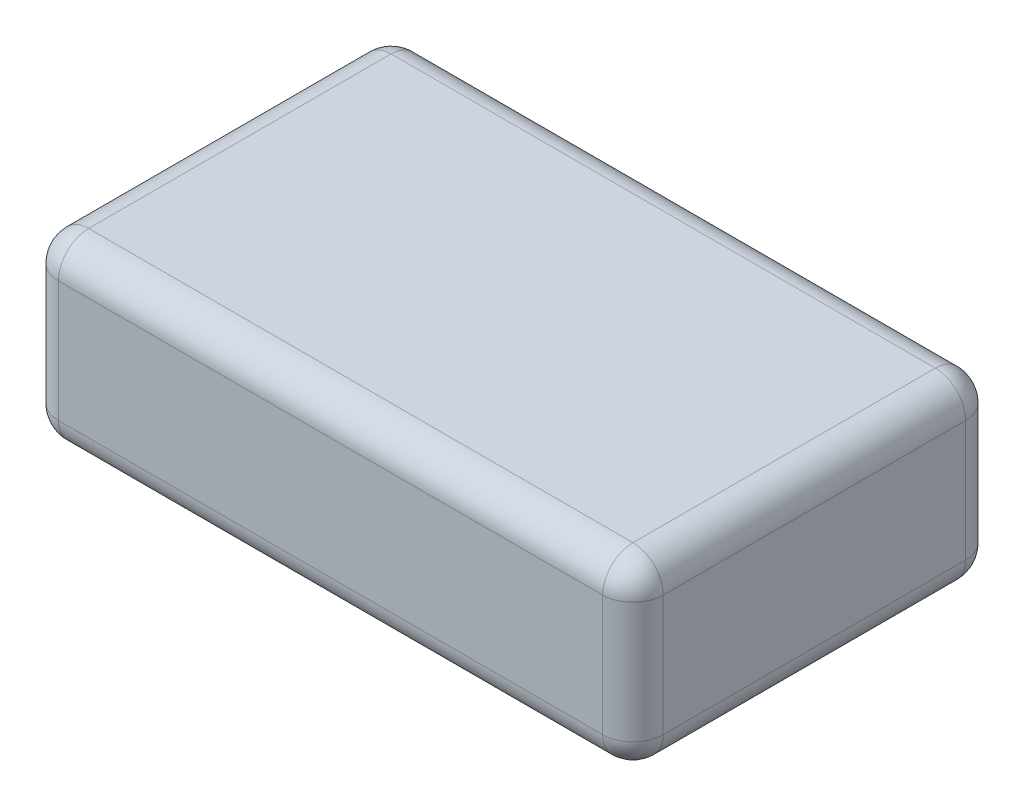
ISO-10303-21;
HEADER;
FILE_DESCRIPTION(('STEP AP214'),'2;1');
FILE_NAME('part.step','',(''),(''),'','','');
FILE_SCHEMA(('AUTOMOTIVE_DESIGN { 1 0 10303 214 1 1 1 1 }'));
ENDSEC;
DATA;
#1=APPLICATION_CONTEXT('core data for automotive mechanical design processes');
#2=APPLICATION_PROTOCOL_DEFINITION('international standard','automotive_design',2000,#1);
#3=PRODUCT_CONTEXT('',#1,'mechanical');
#4=PRODUCT('Part','Part','',(#3));
#5=PRODUCT_RELATED_PRODUCT_CATEGORY('part','',(#4));
#6=PRODUCT_DEFINITION_FORMATION('','',#4);
#7=PRODUCT_DEFINITION_CONTEXT('part definition',#1,'design');
#8=PRODUCT_DEFINITION('design','',#6,#7);
#9=PRODUCT_DEFINITION_SHAPE('','',#8);
#10=(LENGTH_UNIT() NAMED_UNIT(*) SI_UNIT(.MILLI.,.METRE.));
#11=(NAMED_UNIT(*) PLANE_ANGLE_UNIT() SI_UNIT($,.RADIAN.));
#12=(NAMED_UNIT(*) SI_UNIT($,.STERADIAN.) SOLID_ANGLE_UNIT());
#13=UNCERTAINTY_MEASURE_WITH_UNIT(LENGTH_MEASURE(1.E-05),#10,'distance_accuracy_value','');
#14=(GEOMETRIC_REPRESENTATION_CONTEXT(3) GLOBAL_UNCERTAINTY_ASSIGNED_CONTEXT((#13)) GLOBAL_UNIT_ASSIGNED_CONTEXT((#10,
#11,#12)) REPRESENTATION_CONTEXT('',''));
#15=CARTESIAN_POINT('',(0.,0.,0.));
#16=DIRECTION('',(0.,0.,1.));
#17=DIRECTION('',(1.,0.,0.));
#18=AXIS2_PLACEMENT_3D('',#15,#16,#17);
#19=CARTESIAN_POINT('',(100.,60.,60.));
#20=DIRECTION('',(-1.,0.,0.));
#21=DIRECTION('',(0.,0.,1.));
#22=AXIS2_PLACEMENT_3D('',#19,#20,#21);
#23=PLANE('',#22);
#24=DIRECTION('',(0.,0.,-1.));
#25=VECTOR('',#24,1.);
#26=CARTESIAN_POINT('',(100.,50.,60.));
#27=LINE('',#26,#25);
#28=CARTESIAN_POINT('',(100.,50.,-50.));
#29=VERTEX_POINT('',#28);
#30=CARTESIAN_POINT('',(100.,50.,50.));
#31=VERTEX_POINT('',#30);
#32=EDGE_CURVE('E49',#29,#31,#27,.F.);
#33=ORIENTED_EDGE('',*,*,#32,.T.);
#34=DIRECTION('',(0.,-1.,0.));
#35=VECTOR('',#34,1.);
#36=CARTESIAN_POINT('',(100.,60.,50.));
#37=LINE('',#36,#35);
#38=CARTESIAN_POINT('',(100.,10.,50.));
#39=VERTEX_POINT('',#38);
#40=EDGE_CURVE('E11',#31,#39,#37,.T.);
#41=ORIENTED_EDGE('',*,*,#40,.T.);
#42=DIRECTION('',(0.,0.,-1.));
#43=VECTOR('',#42,1.);
#44=CARTESIAN_POINT('',(100.,10.,-60.));
#45=LINE('',#44,#43);
#46=CARTESIAN_POINT('',(100.,10.,-50.));
#47=VERTEX_POINT('',#46);
#48=EDGE_CURVE('E249',#39,#47,#45,.T.);
#49=ORIENTED_EDGE('',*,*,#48,.T.);
#50=DIRECTION('',(0.,-1.,0.));
#51=VECTOR('',#50,1.);
#52=CARTESIAN_POINT('',(100.,60.,-50.));
#53=LINE('',#52,#51);
#54=EDGE_CURVE('E60',#47,#29,#53,.F.);
#55=ORIENTED_EDGE('',*,*,#54,.T.);
#56=EDGE_LOOP('',(#33,#41,#49,#55));
#57=FACE_BOUND('',#56,.T.);
#58=ADVANCED_FACE('F39',(#57),#23,.F.);
#59=CARTESIAN_POINT('',(-100.,60.,-60.));
#60=DIRECTION('',(0.,0.,1.));
#61=DIRECTION('',(1.,0.,0.));
#62=AXIS2_PLACEMENT_3D('',#59,#60,#61);
#63=PLANE('',#62);
#64=DIRECTION('',(0.,-1.,0.));
#65=VECTOR('',#64,1.);
#66=CARTESIAN_POINT('',(-90.,60.,-60.));
#67=LINE('',#66,#65);
#68=CARTESIAN_POINT('',(-90.,10.,-60.));
#69=VERTEX_POINT('',#68);
#70=CARTESIAN_POINT('',(-90.,50.,-60.));
#71=VERTEX_POINT('',#70);
#72=EDGE_CURVE('E244',#69,#71,#67,.F.);
#73=ORIENTED_EDGE('',*,*,#72,.T.);
#74=DIRECTION('',(-1.,0.,0.));
#75=VECTOR('',#74,1.);
#76=CARTESIAN_POINT('',(-100.,50.,-60.));
#77=LINE('',#76,#75);
#78=CARTESIAN_POINT('',(90.,50.,-60.));
#79=VERTEX_POINT('',#78);
#80=EDGE_CURVE('E241',#71,#79,#77,.F.);
#81=ORIENTED_EDGE('',*,*,#80,.T.);
#82=DIRECTION('',(0.,-1.,0.));
#83=VECTOR('',#82,1.);
#84=CARTESIAN_POINT('',(90.,60.,-60.));
#85=LINE('',#84,#83);
#86=CARTESIAN_POINT('',(90.,10.,-60.));
#87=VERTEX_POINT('',#86);
#88=EDGE_CURVE('E233',#79,#87,#85,.T.);
#89=ORIENTED_EDGE('',*,*,#88,.T.);
#90=DIRECTION('',(-1.,0.,0.));
#91=VECTOR('',#90,1.);
#92=CARTESIAN_POINT('',(-100.,10.,-60.));
#93=LINE('',#92,#91);
#94=EDGE_CURVE('E237',#87,#69,#93,.T.);
#95=ORIENTED_EDGE('',*,*,#94,.T.);
#96=EDGE_LOOP('',(#73,#81,#89,#95));
#97=FACE_BOUND('',#96,.T.);
#98=ADVANCED_FACE('F242',(#97),#63,.F.);
#99=CARTESIAN_POINT('',(-100.,60.,60.));
#100=DIRECTION('',(1.,0.,0.));
#101=DIRECTION('',(0.,0.,-1.));
#102=AXIS2_PLACEMENT_3D('',#99,#100,#101);
#103=PLANE('',#102);
#104=DIRECTION('',(0.,0.,1.));
#105=VECTOR('',#104,1.);
#106=CARTESIAN_POINT('',(-100.,10.,60.));
#107=LINE('',#106,#105);
#108=CARTESIAN_POINT('',(-100.,10.,-50.));
#109=VERTEX_POINT('',#108);
#110=CARTESIAN_POINT('',(-100.,10.,50.));
#111=VERTEX_POINT('',#110);
#112=EDGE_CURVE('E296',#109,#111,#107,.T.);
#113=ORIENTED_EDGE('',*,*,#112,.T.);
#114=DIRECTION('',(0.,-1.,0.));
#115=VECTOR('',#114,1.);
#116=CARTESIAN_POINT('',(-100.,60.,50.));
#117=LINE('',#116,#115);
#118=CARTESIAN_POINT('',(-100.,50.,50.));
#119=VERTEX_POINT('',#118);
#120=EDGE_CURVE('E295',#111,#119,#117,.F.);
#121=ORIENTED_EDGE('',*,*,#120,.T.);
#122=DIRECTION('',(0.,0.,1.));
#123=VECTOR('',#122,1.);
#124=CARTESIAN_POINT('',(-100.,50.,60.));
#125=LINE('',#124,#123);
#126=CARTESIAN_POINT('',(-100.,50.,-50.));
#127=VERTEX_POINT('',#126);
#128=EDGE_CURVE('E288',#119,#127,#125,.F.);
#129=ORIENTED_EDGE('',*,*,#128,.T.);
#130=DIRECTION('',(0.,-1.,0.));
#131=VECTOR('',#130,1.);
#132=CARTESIAN_POINT('',(-100.,60.,-50.));
#133=LINE('',#132,#131);
#134=EDGE_CURVE('E347',#127,#109,#133,.T.);
#135=ORIENTED_EDGE('',*,*,#134,.T.);
#136=EDGE_LOOP('',(#113,#121,#129,#135));
#137=FACE_BOUND('',#136,.T.);
#138=ADVANCED_FACE('F299',(#137),#103,.F.);
#139=CARTESIAN_POINT('',(-100.,60.,60.));
#140=DIRECTION('',(0.,0.,-1.));
#141=DIRECTION('',(-1.,0.,0.));
#142=AXIS2_PLACEMENT_3D('',#139,#140,#141);
#143=PLANE('',#142);
#144=DIRECTION('',(1.,0.,0.));
#145=VECTOR('',#144,1.);
#146=CARTESIAN_POINT('',(-100.,50.,60.));
#147=LINE('',#146,#145);
#148=CARTESIAN_POINT('',(90.,50.,60.));
#149=VERTEX_POINT('',#148);
#150=CARTESIAN_POINT('',(-90.,50.,60.));
#151=VERTEX_POINT('',#150);
#152=EDGE_CURVE('E140',#149,#151,#147,.F.);
#153=ORIENTED_EDGE('',*,*,#152,.T.);
#154=DIRECTION('',(0.,-1.,0.));
#155=VECTOR('',#154,1.);
#156=CARTESIAN_POINT('',(-90.,60.,60.));
#157=LINE('',#156,#155);
#158=CARTESIAN_POINT('',(-90.,10.,60.));
#159=VERTEX_POINT('',#158);
#160=EDGE_CURVE('E135',#151,#159,#157,.T.);
#161=ORIENTED_EDGE('',*,*,#160,.T.);
#162=DIRECTION('',(1.,0.,0.));
#163=VECTOR('',#162,1.);
#164=CARTESIAN_POINT('',(100.,10.,60.));
#165=LINE('',#164,#163);
#166=CARTESIAN_POINT('',(90.,10.,60.));
#167=VERTEX_POINT('',#166);
#168=EDGE_CURVE('E129',#159,#167,#165,.T.);
#169=ORIENTED_EDGE('',*,*,#168,.T.);
#170=DIRECTION('',(0.,-1.,0.));
#171=VECTOR('',#170,1.);
#172=CARTESIAN_POINT('',(90.,60.,60.));
#173=LINE('',#172,#171);
#174=EDGE_CURVE('E132',#167,#149,#173,.F.);
#175=ORIENTED_EDGE('',*,*,#174,.T.);
#176=EDGE_LOOP('',(#153,#161,#169,#175));
#177=FACE_BOUND('',#176,.T.);
#178=ADVANCED_FACE('F131',(#177),#143,.F.);
#179=CARTESIAN_POINT('',(0.,60.,0.));
#180=DIRECTION('',(0.,-1.,0.));
#181=DIRECTION('',(0.,0.,-1.));
#182=AXIS2_PLACEMENT_3D('',#179,#180,#181);
#183=PLANE('',#182);
#184=DIRECTION('',(0.,0.,1.));
#185=VECTOR('',#184,1.);
#186=CARTESIAN_POINT('',(-90.,60.,0.));
#187=LINE('',#186,#185);
#188=CARTESIAN_POINT('',(-90.,60.,-50.));
#189=VERTEX_POINT('',#188);
#190=CARTESIAN_POINT('',(-90.,60.,50.));
#191=VERTEX_POINT('',#190);
#192=EDGE_CURVE('E314',#189,#191,#187,.T.);
#193=ORIENTED_EDGE('',*,*,#192,.T.);
#194=DIRECTION('',(1.,0.,0.));
#195=VECTOR('',#194,1.);
#196=CARTESIAN_POINT('',(0.,60.,50.));
#197=LINE('',#196,#195);
#198=CARTESIAN_POINT('',(90.,60.,50.));
#199=VERTEX_POINT('',#198);
#200=EDGE_CURVE('E317',#191,#199,#197,.T.);
#201=ORIENTED_EDGE('',*,*,#200,.T.);
#202=DIRECTION('',(0.,0.,-1.));
#203=VECTOR('',#202,1.);
#204=CARTESIAN_POINT('',(90.,60.,0.));
#205=LINE('',#204,#203);
#206=CARTESIAN_POINT('',(90.,60.,-50.));
#207=VERTEX_POINT('',#206);
#208=EDGE_CURVE('E305',#199,#207,#205,.T.);
#209=ORIENTED_EDGE('',*,*,#208,.T.);
#210=DIRECTION('',(-1.,0.,0.));
#211=VECTOR('',#210,1.);
#212=CARTESIAN_POINT('',(0.,60.,-50.));
#213=LINE('',#212,#211);
#214=EDGE_CURVE('E308',#207,#189,#213,.T.);
#215=ORIENTED_EDGE('',*,*,#214,.T.);
#216=EDGE_LOOP('',(#193,#201,#209,#215));
#217=FACE_BOUND('',#216,.T.);
#218=ADVANCED_FACE('F359',(#217),#183,.F.);
#219=CARTESIAN_POINT('',(0.,0.,0.));
#220=DIRECTION('',(0.,-1.,0.));
#221=DIRECTION('',(0.,0.,-1.));
#222=AXIS2_PLACEMENT_3D('',#219,#220,#221);
#223=PLANE('',#222);
#224=DIRECTION('',(1.,0.,0.));
#225=VECTOR('',#224,1.);
#226=CARTESIAN_POINT('',(-100.,0.,50.));
#227=LINE('',#226,#225);
#228=CARTESIAN_POINT('',(90.,0.,50.));
#229=VERTEX_POINT('',#228);
#230=CARTESIAN_POINT('',(-90.,0.,50.));
#231=VERTEX_POINT('',#230);
#232=EDGE_CURVE('E163',#229,#231,#227,.F.);
#233=ORIENTED_EDGE('',*,*,#232,.T.);
#234=DIRECTION('',(0.,0.,1.));
#235=VECTOR('',#234,1.);
#236=CARTESIAN_POINT('',(-90.,0.,-60.));
#237=LINE('',#236,#235);
#238=CARTESIAN_POINT('',(-90.,0.,-50.));
#239=VERTEX_POINT('',#238);
#240=EDGE_CURVE('E238',#231,#239,#237,.F.);
#241=ORIENTED_EDGE('',*,*,#240,.T.);
#242=DIRECTION('',(-1.,0.,0.));
#243=VECTOR('',#242,1.);
#244=CARTESIAN_POINT('',(100.,0.,-50.));
#245=LINE('',#244,#243);
#246=CARTESIAN_POINT('',(90.,0.,-50.));
#247=VERTEX_POINT('',#246);
#248=EDGE_CURVE('E324',#239,#247,#245,.F.);
#249=ORIENTED_EDGE('',*,*,#248,.T.);
#250=DIRECTION('',(0.,0.,-1.));
#251=VECTOR('',#250,1.);
#252=CARTESIAN_POINT('',(90.,0.,60.));
#253=LINE('',#252,#251);
#254=EDGE_CURVE('E321',#247,#229,#253,.F.);
#255=ORIENTED_EDGE('',*,*,#254,.T.);
#256=EDGE_LOOP('',(#233,#241,#249,#255));
#257=FACE_BOUND('',#256,.T.);
#258=ADVANCED_FACE('F530',(#257),#223,.T.);
#259=CARTESIAN_POINT('',(90.,60.,-50.));
#260=DIRECTION('',(0.,-1.,0.));
#261=DIRECTION('',(0.,0.,-1.));
#262=AXIS2_PLACEMENT_3D('',#259,#260,#261);
#263=CYLINDRICAL_SURFACE('',#262,10.);
#264=CARTESIAN_POINT('',(90.,50.,-50.));
#265=DIRECTION('',(0.,1.,0.));
#266=DIRECTION('',(0.,0.,1.));
#267=AXIS2_PLACEMENT_3D('',#264,#265,#266);
#268=CIRCLE('',#267,10.);
#269=EDGE_CURVE('E43',#29,#79,#268,.T.);
#270=ORIENTED_EDGE('',*,*,#269,.F.);
#271=ORIENTED_EDGE('',*,*,#54,.F.);
#272=CARTESIAN_POINT('',(90.,10.,-50.));
#273=DIRECTION('',(0.,-1.,0.));
#274=DIRECTION('',(0.,0.,-1.));
#275=AXIS2_PLACEMENT_3D('',#272,#273,#274);
#276=CIRCLE('',#275,10.);
#277=EDGE_CURVE('E217',#87,#47,#276,.T.);
#278=ORIENTED_EDGE('',*,*,#277,.F.);
#279=ORIENTED_EDGE('',*,*,#88,.F.);
#280=EDGE_LOOP('',(#270,#271,#278,#279));
#281=FACE_BOUND('',#280,.T.);
#282=ADVANCED_FACE('F41',(#281),#263,.T.);
#283=CARTESIAN_POINT('',(90.,50.,-50.));
#284=DIRECTION('',(0.,0.,1.));
#285=DIRECTION('',(1.,0.,0.));
#286=AXIS2_PLACEMENT_3D('',#283,#284,#285);
#287=SPHERICAL_SURFACE('',#286,10.);
#288=CARTESIAN_POINT('',(90.,50.,-50.));
#289=DIRECTION('',(0.,0.,-1.));
#290=DIRECTION('',(-1.,0.,0.));
#291=AXIS2_PLACEMENT_3D('',#288,#289,#290);
#292=CIRCLE('',#291,10.);
#293=EDGE_CURVE('E211',#29,#207,#292,.F.);
#294=ORIENTED_EDGE('',*,*,#293,.F.);
#295=ORIENTED_EDGE('',*,*,#269,.T.);
#296=CARTESIAN_POINT('',(90.,50.,-50.));
#297=DIRECTION('',(1.,0.,0.));
#298=DIRECTION('',(0.,1.,0.));
#299=AXIS2_PLACEMENT_3D('',#296,#297,#298);
#300=CIRCLE('',#299,10.);
#301=EDGE_CURVE('E215',#207,#79,#300,.F.);
#302=ORIENTED_EDGE('',*,*,#301,.F.);
#303=EDGE_LOOP('',(#294,#295,#302));
#304=FACE_BOUND('',#303,.T.);
#305=ADVANCED_FACE('F230',(#304),#287,.T.);
#306=CARTESIAN_POINT('',(90.,10.,-50.));
#307=DIRECTION('',(0.,0.,1.));
#308=DIRECTION('',(1.,0.,0.));
#309=AXIS2_PLACEMENT_3D('',#306,#307,#308);
#310=SPHERICAL_SURFACE('',#309,10.);
#311=CARTESIAN_POINT('',(90.,10.,-50.));
#312=DIRECTION('',(1.,0.,0.));
#313=DIRECTION('',(0.,0.,-1.));
#314=AXIS2_PLACEMENT_3D('',#311,#312,#313);
#315=CIRCLE('',#314,10.);
#316=EDGE_CURVE('E203',#87,#247,#315,.F.);
#317=ORIENTED_EDGE('',*,*,#316,.F.);
#318=ORIENTED_EDGE('',*,*,#277,.T.);
#319=CARTESIAN_POINT('',(90.,10.,-50.));
#320=DIRECTION('',(0.,0.,-1.));
#321=DIRECTION('',(-1.,0.,0.));
#322=AXIS2_PLACEMENT_3D('',#319,#320,#321);
#323=CIRCLE('',#322,10.);
#324=EDGE_CURVE('E207',#247,#47,#323,.F.);
#325=ORIENTED_EDGE('',*,*,#324,.F.);
#326=EDGE_LOOP('',(#317,#318,#325));
#327=FACE_BOUND('',#326,.T.);
#328=ADVANCED_FACE('F509',(#327),#310,.T.);
#329=CARTESIAN_POINT('',(0.,50.,-50.));
#330=DIRECTION('',(-1.,0.,0.));
#331=DIRECTION('',(0.,0.,1.));
#332=AXIS2_PLACEMENT_3D('',#329,#330,#331);
#333=CYLINDRICAL_SURFACE('',#332,10.);
#334=ORIENTED_EDGE('',*,*,#301,.T.);
#335=ORIENTED_EDGE('',*,*,#80,.F.);
#336=CARTESIAN_POINT('',(-90.,50.,-50.));
#337=DIRECTION('',(-1.,0.,0.));
#338=DIRECTION('',(0.,0.,1.));
#339=AXIS2_PLACEMENT_3D('',#336,#337,#338);
#340=CIRCLE('',#339,10.);
#341=EDGE_CURVE('E195',#189,#71,#340,.T.);
#342=ORIENTED_EDGE('',*,*,#341,.F.);
#343=ORIENTED_EDGE('',*,*,#214,.F.);
#344=EDGE_LOOP('',(#334,#335,#342,#343));
#345=FACE_BOUND('',#344,.T.);
#346=ADVANCED_FACE('F361',(#345),#333,.T.);
#347=CARTESIAN_POINT('',(90.,50.,0.));
#348=DIRECTION('',(0.,0.,-1.));
#349=DIRECTION('',(-1.,0.,0.));
#350=AXIS2_PLACEMENT_3D('',#347,#348,#349);
#351=CYLINDRICAL_SURFACE('',#350,10.);
#352=ORIENTED_EDGE('',*,*,#293,.T.);
#353=ORIENTED_EDGE('',*,*,#208,.F.);
#354=CARTESIAN_POINT('',(90.,50.,50.));
#355=DIRECTION('',(0.,0.,1.));
#356=DIRECTION('',(1.,0.,0.));
#357=AXIS2_PLACEMENT_3D('',#354,#355,#356);
#358=CIRCLE('',#357,10.);
#359=EDGE_CURVE('E191',#31,#199,#358,.T.);
#360=ORIENTED_EDGE('',*,*,#359,.F.);
#361=ORIENTED_EDGE('',*,*,#32,.F.);
#362=EDGE_LOOP('',(#352,#353,#360,#361));
#363=FACE_BOUND('',#362,.T.);
#364=ADVANCED_FACE('F493',(#363),#351,.T.);
#365=CARTESIAN_POINT('',(90.,60.,50.));
#366=DIRECTION('',(0.,-1.,0.));
#367=DIRECTION('',(0.,0.,-1.));
#368=AXIS2_PLACEMENT_3D('',#365,#366,#367);
#369=CYLINDRICAL_SURFACE('',#368,10.);
#370=CARTESIAN_POINT('',(90.,10.,50.));
#371=DIRECTION('',(0.,-1.,0.));
#372=DIRECTION('',(0.,0.,-1.));
#373=AXIS2_PLACEMENT_3D('',#370,#371,#372);
#374=CIRCLE('',#373,10.);
#375=EDGE_CURVE('E146',#39,#167,#374,.T.);
#376=ORIENTED_EDGE('',*,*,#375,.F.);
#377=ORIENTED_EDGE('',*,*,#40,.F.);
#378=CARTESIAN_POINT('',(90.,50.,50.));
#379=DIRECTION('',(0.,1.,0.));
#380=DIRECTION('',(0.,0.,1.));
#381=AXIS2_PLACEMENT_3D('',#378,#379,#380);
#382=CIRCLE('',#381,10.);
#383=EDGE_CURVE('E149',#149,#31,#382,.T.);
#384=ORIENTED_EDGE('',*,*,#383,.F.);
#385=ORIENTED_EDGE('',*,*,#174,.F.);
#386=EDGE_LOOP('',(#376,#377,#384,#385));
#387=FACE_BOUND('',#386,.T.);
#388=ADVANCED_FACE('F145',(#387),#369,.T.);
#389=CARTESIAN_POINT('',(90.,10.,60.));
#390=DIRECTION('',(0.,0.,1.));
#391=DIRECTION('',(1.,0.,0.));
#392=AXIS2_PLACEMENT_3D('',#389,#390,#391);
#393=CYLINDRICAL_SURFACE('',#392,10.);
#394=ORIENTED_EDGE('',*,*,#324,.T.);
#395=ORIENTED_EDGE('',*,*,#48,.F.);
#396=CARTESIAN_POINT('',(90.,10.,50.));
#397=DIRECTION('',(0.,0.,1.));
#398=DIRECTION('',(1.,0.,0.));
#399=AXIS2_PLACEMENT_3D('',#396,#397,#398);
#400=CIRCLE('',#399,10.);
#401=EDGE_CURVE('E159',#229,#39,#400,.T.);
#402=ORIENTED_EDGE('',*,*,#401,.F.);
#403=ORIENTED_EDGE('',*,*,#254,.F.);
#404=EDGE_LOOP('',(#394,#395,#402,#403));
#405=FACE_BOUND('',#404,.T.);
#406=ADVANCED_FACE('F477',(#405),#393,.T.);
#407=CARTESIAN_POINT('',(-100.,10.,-50.));
#408=DIRECTION('',(1.,0.,0.));
#409=DIRECTION('',(0.,0.,-1.));
#410=AXIS2_PLACEMENT_3D('',#407,#408,#409);
#411=CYLINDRICAL_SURFACE('',#410,10.);
#412=ORIENTED_EDGE('',*,*,#316,.T.);
#413=ORIENTED_EDGE('',*,*,#248,.F.);
#414=CARTESIAN_POINT('',(-90.,10.,-50.));
#415=DIRECTION('',(-1.,0.,0.));
#416=DIRECTION('',(0.,0.,1.));
#417=AXIS2_PLACEMENT_3D('',#414,#415,#416);
#418=CIRCLE('',#417,10.);
#419=EDGE_CURVE('E183',#69,#239,#418,.T.);
#420=ORIENTED_EDGE('',*,*,#419,.F.);
#421=ORIENTED_EDGE('',*,*,#94,.F.);
#422=EDGE_LOOP('',(#412,#413,#420,#421));
#423=FACE_BOUND('',#422,.T.);
#424=ADVANCED_FACE('F340',(#423),#411,.T.);
#425=CARTESIAN_POINT('',(-90.,60.,-50.));
#426=DIRECTION('',(0.,-1.,0.));
#427=DIRECTION('',(0.,0.,-1.));
#428=AXIS2_PLACEMENT_3D('',#425,#426,#427);
#429=CYLINDRICAL_SURFACE('',#428,10.);
#430=CARTESIAN_POINT('',(-90.,50.,-50.));
#431=DIRECTION('',(0.,1.,0.));
#432=DIRECTION('',(0.,0.,1.));
#433=AXIS2_PLACEMENT_3D('',#430,#431,#432);
#434=CIRCLE('',#433,10.);
#435=EDGE_CURVE('E199',#71,#127,#434,.T.);
#436=ORIENTED_EDGE('',*,*,#435,.F.);
#437=ORIENTED_EDGE('',*,*,#72,.F.);
#438=CARTESIAN_POINT('',(-90.,10.,-50.));
#439=DIRECTION('',(0.,-1.,0.));
#440=DIRECTION('',(0.,0.,-1.));
#441=AXIS2_PLACEMENT_3D('',#438,#439,#440);
#442=CIRCLE('',#441,10.);
#443=EDGE_CURVE('E179',#109,#69,#442,.T.);
#444=ORIENTED_EDGE('',*,*,#443,.F.);
#445=ORIENTED_EDGE('',*,*,#134,.F.);
#446=EDGE_LOOP('',(#436,#437,#444,#445));
#447=FACE_BOUND('',#446,.T.);
#448=ADVANCED_FACE('F337',(#447),#429,.T.);
#449=CARTESIAN_POINT('',(-90.,50.,-50.));
#450=DIRECTION('',(0.,0.,1.));
#451=DIRECTION('',(1.,0.,0.));
#452=AXIS2_PLACEMENT_3D('',#449,#450,#451);
#453=SPHERICAL_SURFACE('',#452,10.);
#454=ORIENTED_EDGE('',*,*,#341,.T.);
#455=ORIENTED_EDGE('',*,*,#435,.T.);
#456=CARTESIAN_POINT('',(-90.,50.,-50.));
#457=DIRECTION('',(0.,0.,-1.));
#458=DIRECTION('',(0.,1.,0.));
#459=AXIS2_PLACEMENT_3D('',#456,#457,#458);
#460=CIRCLE('',#459,10.);
#461=EDGE_CURVE('E170',#189,#127,#460,.F.);
#462=ORIENTED_EDGE('',*,*,#461,.F.);
#463=EDGE_LOOP('',(#454,#455,#462));
#464=FACE_BOUND('',#463,.T.);
#465=ADVANCED_FACE('F363',(#464),#453,.T.);
#466=CARTESIAN_POINT('',(90.,50.,50.));
#467=DIRECTION('',(0.,0.,1.));
#468=DIRECTION('',(1.,0.,0.));
#469=AXIS2_PLACEMENT_3D('',#466,#467,#468);
#470=SPHERICAL_SURFACE('',#469,10.);
#471=ORIENTED_EDGE('',*,*,#383,.T.);
#472=ORIENTED_EDGE('',*,*,#359,.T.);
#473=CARTESIAN_POINT('',(90.,50.,50.));
#474=DIRECTION('',(1.,0.,0.));
#475=DIRECTION('',(0.,0.,-1.));
#476=AXIS2_PLACEMENT_3D('',#473,#474,#475);
#477=CIRCLE('',#476,10.);
#478=EDGE_CURVE('E165',#149,#199,#477,.F.);
#479=ORIENTED_EDGE('',*,*,#478,.F.);
#480=EDGE_LOOP('',(#471,#472,#479));
#481=FACE_BOUND('',#480,.T.);
#482=ADVANCED_FACE('F365',(#481),#470,.T.);
#483=CARTESIAN_POINT('',(90.,10.,50.));
#484=DIRECTION('',(0.,0.,1.));
#485=DIRECTION('',(1.,0.,0.));
#486=AXIS2_PLACEMENT_3D('',#483,#484,#485);
#487=SPHERICAL_SURFACE('',#486,10.);
#488=ORIENTED_EDGE('',*,*,#401,.T.);
#489=ORIENTED_EDGE('',*,*,#375,.T.);
#490=CARTESIAN_POINT('',(90.,10.,50.));
#491=DIRECTION('',(1.,0.,0.));
#492=DIRECTION('',(0.,0.,-1.));
#493=AXIS2_PLACEMENT_3D('',#490,#491,#492);
#494=CIRCLE('',#493,10.);
#495=EDGE_CURVE('E156',#229,#167,#494,.F.);
#496=ORIENTED_EDGE('',*,*,#495,.F.);
#497=EDGE_LOOP('',(#488,#489,#496));
#498=FACE_BOUND('',#497,.T.);
#499=ADVANCED_FACE('F155',(#498),#487,.T.);
#500=CARTESIAN_POINT('',(-90.,10.,-50.));
#501=DIRECTION('',(0.,0.,1.));
#502=DIRECTION('',(1.,0.,0.));
#503=AXIS2_PLACEMENT_3D('',#500,#501,#502);
#504=SPHERICAL_SURFACE('',#503,10.);
#505=ORIENTED_EDGE('',*,*,#443,.T.);
#506=ORIENTED_EDGE('',*,*,#419,.T.);
#507=CARTESIAN_POINT('',(-90.,10.,-50.));
#508=DIRECTION('',(0.,0.,-1.));
#509=DIRECTION('',(-1.,0.,0.));
#510=AXIS2_PLACEMENT_3D('',#507,#508,#509);
#511=CIRCLE('',#510,10.);
#512=EDGE_CURVE('E166',#109,#239,#511,.F.);
#513=ORIENTED_EDGE('',*,*,#512,.F.);
#514=EDGE_LOOP('',(#505,#506,#513));
#515=FACE_BOUND('',#514,.T.);
#516=ADVANCED_FACE('F342',(#515),#504,.T.);
#517=CARTESIAN_POINT('',(-90.,50.,0.));
#518=DIRECTION('',(0.,0.,1.));
#519=DIRECTION('',(1.,0.,0.));
#520=AXIS2_PLACEMENT_3D('',#517,#518,#519);
#521=CYLINDRICAL_SURFACE('',#520,10.);
#522=ORIENTED_EDGE('',*,*,#461,.T.);
#523=ORIENTED_EDGE('',*,*,#128,.F.);
#524=CARTESIAN_POINT('',(-90.,50.,50.));
#525=DIRECTION('',(0.,0.,1.));
#526=DIRECTION('',(1.,0.,0.));
#527=AXIS2_PLACEMENT_3D('',#524,#525,#526);
#528=CIRCLE('',#527,10.);
#529=EDGE_CURVE('E172',#191,#119,#528,.T.);
#530=ORIENTED_EDGE('',*,*,#529,.F.);
#531=ORIENTED_EDGE('',*,*,#192,.F.);
#532=EDGE_LOOP('',(#522,#523,#530,#531));
#533=FACE_BOUND('',#532,.T.);
#534=ADVANCED_FACE('F290',(#533),#521,.T.);
#535=CARTESIAN_POINT('',(0.,50.,50.));
#536=DIRECTION('',(1.,0.,0.));
#537=DIRECTION('',(0.,0.,-1.));
#538=AXIS2_PLACEMENT_3D('',#535,#536,#537);
#539=CYLINDRICAL_SURFACE('',#538,10.);
#540=ORIENTED_EDGE('',*,*,#478,.T.);
#541=ORIENTED_EDGE('',*,*,#200,.F.);
#542=CARTESIAN_POINT('',(-90.,50.,50.));
#543=DIRECTION('',(-1.,0.,0.));
#544=DIRECTION('',(0.,0.,1.));
#545=AXIS2_PLACEMENT_3D('',#542,#543,#544);
#546=CIRCLE('',#545,10.);
#547=EDGE_CURVE('E275',#151,#191,#546,.T.);
#548=ORIENTED_EDGE('',*,*,#547,.F.);
#549=ORIENTED_EDGE('',*,*,#152,.F.);
#550=EDGE_LOOP('',(#540,#541,#548,#549));
#551=FACE_BOUND('',#550,.T.);
#552=ADVANCED_FACE('F357',(#551),#539,.T.);
#553=CARTESIAN_POINT('',(-100.,10.,50.));
#554=DIRECTION('',(-1.,0.,0.));
#555=DIRECTION('',(0.,0.,1.));
#556=AXIS2_PLACEMENT_3D('',#553,#554,#555);
#557=CYLINDRICAL_SURFACE('',#556,10.);
#558=ORIENTED_EDGE('',*,*,#495,.T.);
#559=ORIENTED_EDGE('',*,*,#168,.F.);
#560=CARTESIAN_POINT('',(-90.,10.,50.));
#561=DIRECTION('',(-1.,0.,0.));
#562=DIRECTION('',(0.,0.,1.));
#563=AXIS2_PLACEMENT_3D('',#560,#561,#562);
#564=CIRCLE('',#563,10.);
#565=EDGE_CURVE('E271',#231,#159,#564,.T.);
#566=ORIENTED_EDGE('',*,*,#565,.F.);
#567=ORIENTED_EDGE('',*,*,#232,.F.);
#568=EDGE_LOOP('',(#558,#559,#566,#567));
#569=FACE_BOUND('',#568,.T.);
#570=ADVANCED_FACE('F162',(#569),#557,.T.);
#571=CARTESIAN_POINT('',(-90.,10.,60.));
#572=DIRECTION('',(0.,0.,-1.));
#573=DIRECTION('',(-1.,0.,0.));
#574=AXIS2_PLACEMENT_3D('',#571,#572,#573);
#575=CYLINDRICAL_SURFACE('',#574,10.);
#576=ORIENTED_EDGE('',*,*,#512,.T.);
#577=ORIENTED_EDGE('',*,*,#240,.F.);
#578=CARTESIAN_POINT('',(-90.,10.,50.));
#579=DIRECTION('',(0.,0.,1.));
#580=DIRECTION('',(1.,0.,0.));
#581=AXIS2_PLACEMENT_3D('',#578,#579,#580);
#582=CIRCLE('',#581,10.);
#583=EDGE_CURVE('E267',#111,#231,#582,.T.);
#584=ORIENTED_EDGE('',*,*,#583,.F.);
#585=ORIENTED_EDGE('',*,*,#112,.F.);
#586=EDGE_LOOP('',(#576,#577,#584,#585));
#587=FACE_BOUND('',#586,.T.);
#588=ADVANCED_FACE('F345',(#587),#575,.T.);
#589=CARTESIAN_POINT('',(-90.,50.,50.));
#590=DIRECTION('',(0.,0.,1.));
#591=DIRECTION('',(1.,0.,0.));
#592=AXIS2_PLACEMENT_3D('',#589,#590,#591);
#593=SPHERICAL_SURFACE('',#592,10.);
#594=ORIENTED_EDGE('',*,*,#547,.T.);
#595=ORIENTED_EDGE('',*,*,#529,.T.);
#596=CARTESIAN_POINT('',(-90.,50.,50.));
#597=DIRECTION('',(0.,1.,0.));
#598=DIRECTION('',(0.,0.,1.));
#599=AXIS2_PLACEMENT_3D('',#596,#597,#598);
#600=CIRCLE('',#599,10.);
#601=EDGE_CURVE('E264',#151,#119,#600,.F.);
#602=ORIENTED_EDGE('',*,*,#601,.F.);
#603=EDGE_LOOP('',(#594,#595,#602));
#604=FACE_BOUND('',#603,.T.);
#605=ADVANCED_FACE('F284',(#604),#593,.T.);
#606=CARTESIAN_POINT('',(-90.,10.,50.));
#607=DIRECTION('',(0.,0.,1.));
#608=DIRECTION('',(1.,0.,0.));
#609=AXIS2_PLACEMENT_3D('',#606,#607,#608);
#610=SPHERICAL_SURFACE('',#609,10.);
#611=ORIENTED_EDGE('',*,*,#583,.T.);
#612=ORIENTED_EDGE('',*,*,#565,.T.);
#613=CARTESIAN_POINT('',(-90.,10.,50.));
#614=DIRECTION('',(0.,-1.,0.));
#615=DIRECTION('',(0.,0.,-1.));
#616=AXIS2_PLACEMENT_3D('',#613,#614,#615);
#617=CIRCLE('',#616,10.);
#618=EDGE_CURVE('E261',#111,#159,#617,.F.);
#619=ORIENTED_EDGE('',*,*,#618,.F.);
#620=EDGE_LOOP('',(#611,#612,#619));
#621=FACE_BOUND('',#620,.T.);
#622=ADVANCED_FACE('F385',(#621),#610,.T.);
#623=CARTESIAN_POINT('',(-90.,60.,50.));
#624=DIRECTION('',(0.,-1.,0.));
#625=DIRECTION('',(0.,0.,-1.));
#626=AXIS2_PLACEMENT_3D('',#623,#624,#625);
#627=CYLINDRICAL_SURFACE('',#626,10.);
#628=ORIENTED_EDGE('',*,*,#601,.T.);
#629=ORIENTED_EDGE('',*,*,#120,.F.);
#630=ORIENTED_EDGE('',*,*,#618,.T.);
#631=ORIENTED_EDGE('',*,*,#160,.F.);
#632=EDGE_LOOP('',(#628,#629,#630,#631));
#633=FACE_BOUND('',#632,.T.);
#634=ADVANCED_FACE('F382',(#633),#627,.T.);
#635=CLOSED_SHELL('',(#58,#98,#138,#178,#218,#258,#282,#305,#328,#346,#364,#388,#406,#424,#448,
#465,#482,#499,#516,#534,#552,#570,#588,#605,#622,#634));
#636=MANIFOLD_SOLID_BREP('B2',#635);
#637=ADVANCED_BREP_SHAPE_REPRESENTATION('',(#18,#636),#14);
#638=SHAPE_DEFINITION_REPRESENTATION(#9,#637);
ENDSEC;
END-ISO-10303-21;
